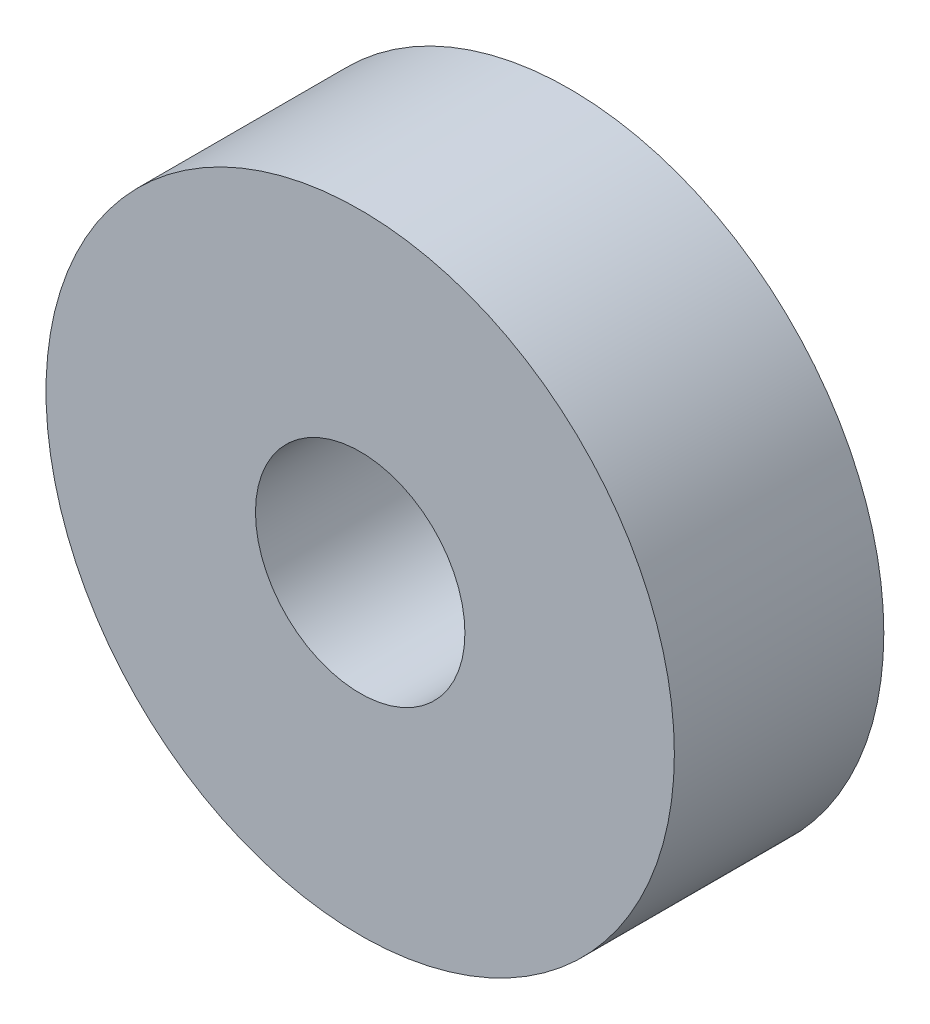
ISO-10303-21;
HEADER;
FILE_DESCRIPTION(('STEP AP214'),'2;1');
FILE_NAME('part.step','',(''),(''),'','','');
FILE_SCHEMA(('AUTOMOTIVE_DESIGN { 1 0 10303 214 1 1 1 1 }'));
ENDSEC;
DATA;
#1=APPLICATION_CONTEXT('core data for automotive mechanical design processes');
#2=APPLICATION_PROTOCOL_DEFINITION('international standard','automotive_design',2000,#1);
#3=PRODUCT_CONTEXT('',#1,'mechanical');
#4=PRODUCT('Part','Part','',(#3));
#5=PRODUCT_RELATED_PRODUCT_CATEGORY('part','',(#4));
#6=PRODUCT_DEFINITION_FORMATION('','',#4);
#7=PRODUCT_DEFINITION_CONTEXT('part definition',#1,'design');
#8=PRODUCT_DEFINITION('design','',#6,#7);
#9=PRODUCT_DEFINITION_SHAPE('','',#8);
#10=(LENGTH_UNIT() NAMED_UNIT(*) SI_UNIT(.MILLI.,.METRE.));
#11=(NAMED_UNIT(*) PLANE_ANGLE_UNIT() SI_UNIT($,.RADIAN.));
#12=(NAMED_UNIT(*) SI_UNIT($,.STERADIAN.) SOLID_ANGLE_UNIT());
#13=UNCERTAINTY_MEASURE_WITH_UNIT(LENGTH_MEASURE(1.E-05),#10,'distance_accuracy_value','');
#14=(GEOMETRIC_REPRESENTATION_CONTEXT(3) GLOBAL_UNCERTAINTY_ASSIGNED_CONTEXT((#13)) GLOBAL_UNIT_ASSIGNED_CONTEXT((#10,
#11,#12)) REPRESENTATION_CONTEXT('',''));
#15=CARTESIAN_POINT('',(0.,0.,0.));
#16=DIRECTION('',(0.,0.,1.));
#17=DIRECTION('',(1.,0.,0.));
#18=AXIS2_PLACEMENT_3D('',#15,#16,#17);
#19=CARTESIAN_POINT('',(0.,0.,2.));
#20=DIRECTION('',(0.,0.,1.));
#21=DIRECTION('',(1.,0.,0.));
#22=AXIS2_PLACEMENT_3D('',#19,#20,#21);
#23=PLANE('',#22);
#24=CARTESIAN_POINT('',(0.,0.,2.));
#25=DIRECTION('',(0.,0.,1.));
#26=DIRECTION('',(1.,0.,0.));
#27=AXIS2_PLACEMENT_3D('',#24,#25,#26);
#28=CIRCLE('',#27,6.);
#29=CARTESIAN_POINT('',(6.,0.,2.));
#30=VERTEX_POINT('',#29);
#31=EDGE_CURVE('E10',#30,#30,#28,.T.);
#32=ORIENTED_EDGE('',*,*,#31,.T.);
#33=EDGE_LOOP('',(#32));
#34=FACE_BOUND('',#33,.T.);
#35=CARTESIAN_POINT('',(0.,0.,2.));
#36=DIRECTION('',(0.,0.,1.));
#37=DIRECTION('',(1.,0.,0.));
#38=AXIS2_PLACEMENT_3D('',#35,#36,#37);
#39=CIRCLE('',#38,2.);
#40=CARTESIAN_POINT('',(2.,0.,2.));
#41=VERTEX_POINT('',#40);
#42=EDGE_CURVE('E42',#41,#41,#39,.T.);
#43=ORIENTED_EDGE('',*,*,#42,.F.);
#44=EDGE_LOOP('',(#43));
#45=FACE_BOUND('',#44,.T.);
#46=ADVANCED_FACE('F31',(#34,#45),#23,.T.);
#47=CARTESIAN_POINT('',(0.,0.,-2.));
#48=DIRECTION('',(0.,0.,1.));
#49=DIRECTION('',(1.,0.,0.));
#50=AXIS2_PLACEMENT_3D('',#47,#48,#49);
#51=PLANE('',#50);
#52=CARTESIAN_POINT('',(0.,0.,-2.));
#53=DIRECTION('',(0.,0.,1.));
#54=DIRECTION('',(1.,0.,0.));
#55=AXIS2_PLACEMENT_3D('',#52,#53,#54);
#56=CIRCLE('',#55,6.);
#57=CARTESIAN_POINT('',(6.,0.,-2.));
#58=VERTEX_POINT('',#57);
#59=EDGE_CURVE('E35',#58,#58,#56,.T.);
#60=ORIENTED_EDGE('',*,*,#59,.F.);
#61=EDGE_LOOP('',(#60));
#62=FACE_BOUND('',#61,.T.);
#63=CARTESIAN_POINT('',(0.,0.,-2.));
#64=DIRECTION('',(0.,0.,1.));
#65=DIRECTION('',(1.,0.,0.));
#66=AXIS2_PLACEMENT_3D('',#63,#64,#65);
#67=CIRCLE('',#66,2.);
#68=CARTESIAN_POINT('',(2.,0.,-2.));
#69=VERTEX_POINT('',#68);
#70=EDGE_CURVE('E44',#69,#69,#67,.T.);
#71=ORIENTED_EDGE('',*,*,#70,.T.);
#72=EDGE_LOOP('',(#71));
#73=FACE_BOUND('',#72,.T.);
#74=ADVANCED_FACE('F54',(#62,#73),#51,.F.);
#75=CARTESIAN_POINT('',(0.,0.,2.));
#76=DIRECTION('',(0.,0.,-1.));
#77=DIRECTION('',(-1.,0.,0.));
#78=AXIS2_PLACEMENT_3D('',#75,#76,#77);
#79=CYLINDRICAL_SURFACE('',#78,6.);
#80=ORIENTED_EDGE('',*,*,#31,.F.);
#81=EDGE_LOOP('',(#80));
#82=FACE_BOUND('',#81,.T.);
#83=ORIENTED_EDGE('',*,*,#59,.T.);
#84=EDGE_LOOP('',(#83));
#85=FACE_BOUND('',#84,.T.);
#86=ADVANCED_FACE('F33',(#82,#85),#79,.T.);
#87=CARTESIAN_POINT('',(0.,0.,2.));
#88=DIRECTION('',(0.,0.,-1.));
#89=DIRECTION('',(-1.,0.,0.));
#90=AXIS2_PLACEMENT_3D('',#87,#88,#89);
#91=CYLINDRICAL_SURFACE('',#90,2.);
#92=ORIENTED_EDGE('',*,*,#42,.T.);
#93=EDGE_LOOP('',(#92));
#94=FACE_BOUND('',#93,.T.);
#95=ORIENTED_EDGE('',*,*,#70,.F.);
#96=EDGE_LOOP('',(#95));
#97=FACE_BOUND('',#96,.T.);
#98=ADVANCED_FACE('F50',(#94,#97),#91,.F.);
#99=CLOSED_SHELL('',(#46,#74,#86,#98));
#100=MANIFOLD_SOLID_BREP('B2',#99);
#101=ADVANCED_BREP_SHAPE_REPRESENTATION('',(#18,#100),#14);
#102=SHAPE_DEFINITION_REPRESENTATION(#9,#101);
ENDSEC;
END-ISO-10303-21;
